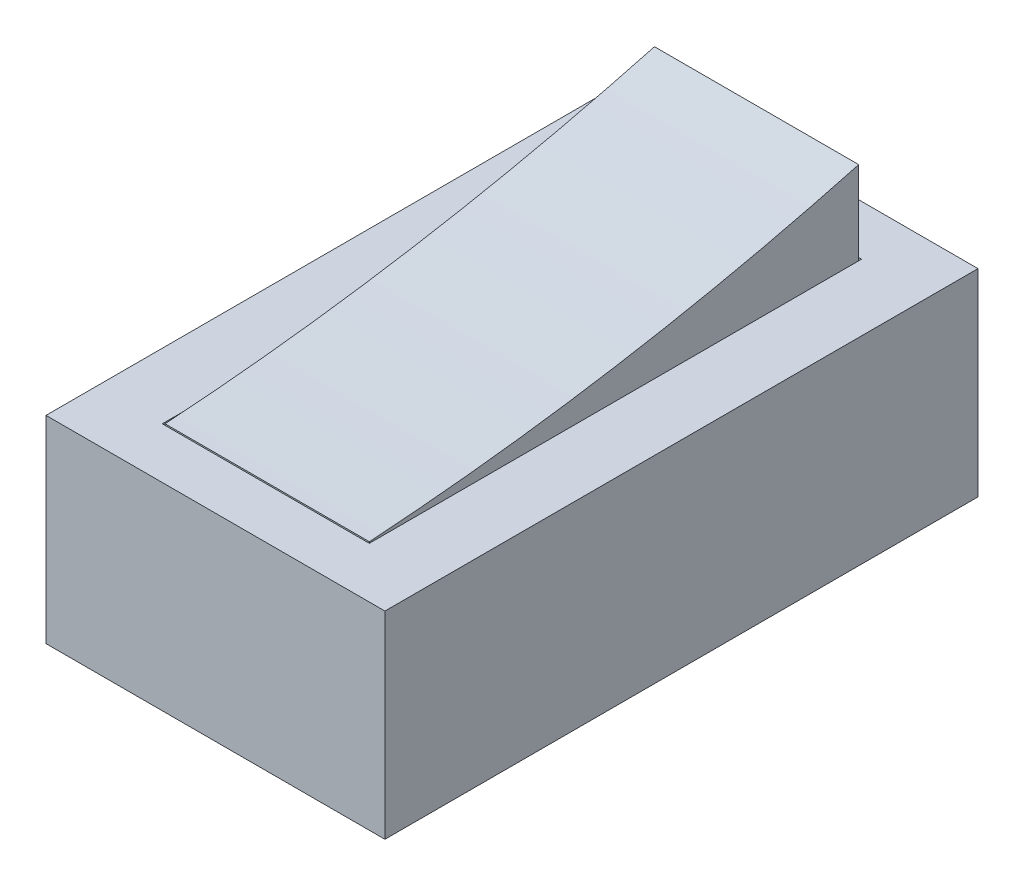
ISO-10303-21;
HEADER;
FILE_DESCRIPTION(('STEP AP214'),'2;1');
FILE_NAME('part.step','',(''),(''),'','','');
FILE_SCHEMA(('AUTOMOTIVE_DESIGN { 1 0 10303 214 1 1 1 1 }'));
ENDSEC;
DATA;
#1=APPLICATION_CONTEXT('core data for automotive mechanical design processes');
#2=APPLICATION_PROTOCOL_DEFINITION('international standard','automotive_design',2000,#1);
#3=PRODUCT_CONTEXT('',#1,'mechanical');
#4=PRODUCT('Part','Part','',(#3));
#5=PRODUCT_RELATED_PRODUCT_CATEGORY('part','',(#4));
#6=PRODUCT_DEFINITION_FORMATION('','',#4);
#7=PRODUCT_DEFINITION_CONTEXT('part definition',#1,'design');
#8=PRODUCT_DEFINITION('design','',#6,#7);
#9=PRODUCT_DEFINITION_SHAPE('','',#8);
#10=(LENGTH_UNIT() NAMED_UNIT(*) SI_UNIT(.MILLI.,.METRE.));
#11=(NAMED_UNIT(*) PLANE_ANGLE_UNIT() SI_UNIT($,.RADIAN.));
#12=(NAMED_UNIT(*) SI_UNIT($,.STERADIAN.) SOLID_ANGLE_UNIT());
#13=UNCERTAINTY_MEASURE_WITH_UNIT(LENGTH_MEASURE(1.E-05),#10,'distance_accuracy_value','');
#14=(GEOMETRIC_REPRESENTATION_CONTEXT(3) GLOBAL_UNCERTAINTY_ASSIGNED_CONTEXT((#13)) GLOBAL_UNIT_ASSIGNED_CONTEXT((#10,
#11,#12)) REPRESENTATION_CONTEXT('',''));
#15=CARTESIAN_POINT('',(0.,0.,0.));
#16=DIRECTION('',(0.,0.,1.));
#17=DIRECTION('',(1.,0.,0.));
#18=AXIS2_PLACEMENT_3D('',#15,#16,#17);
#19=CARTESIAN_POINT('',(6.,7.,-10.5));
#20=DIRECTION('',(-1.,0.,0.));
#21=DIRECTION('',(0.,0.,1.));
#22=AXIS2_PLACEMENT_3D('',#19,#20,#21);
#23=PLANE('',#22);
#24=DIRECTION('',(0.,0.,-1.));
#25=VECTOR('',#24,1.);
#26=CARTESIAN_POINT('',(6.,0.,-10.5));
#27=LINE('',#26,#25);
#28=CARTESIAN_POINT('',(6.,0.,10.5));
#29=VERTEX_POINT('',#28);
#30=CARTESIAN_POINT('',(6.,0.,-10.5));
#31=VERTEX_POINT('',#30);
#32=EDGE_CURVE('E134',#29,#31,#27,.T.);
#33=ORIENTED_EDGE('',*,*,#32,.T.);
#34=DIRECTION('',(0.,-1.,0.));
#35=VECTOR('',#34,1.);
#36=CARTESIAN_POINT('',(6.,7.,-10.5));
#37=LINE('',#36,#35);
#38=CARTESIAN_POINT('',(6.,7.,-10.5));
#39=VERTEX_POINT('',#38);
#40=EDGE_CURVE('E141',#39,#31,#37,.T.);
#41=ORIENTED_EDGE('',*,*,#40,.F.);
#42=DIRECTION('',(0.,0.,-1.));
#43=VECTOR('',#42,1.);
#44=CARTESIAN_POINT('',(6.,7.,-10.5));
#45=LINE('',#44,#43);
#46=CARTESIAN_POINT('',(6.,7.,10.5));
#47=VERTEX_POINT('',#46);
#48=EDGE_CURVE('E122',#47,#39,#45,.T.);
#49=ORIENTED_EDGE('',*,*,#48,.F.);
#50=DIRECTION('',(0.,-1.,0.));
#51=VECTOR('',#50,1.);
#52=CARTESIAN_POINT('',(6.,7.,10.5));
#53=LINE('',#52,#51);
#54=EDGE_CURVE('E137',#47,#29,#53,.T.);
#55=ORIENTED_EDGE('',*,*,#54,.T.);
#56=EDGE_LOOP('',(#33,#41,#49,#55));
#57=FACE_BOUND('',#56,.T.);
#58=ADVANCED_FACE('F43',(#57),#23,.F.);
#59=CARTESIAN_POINT('',(-6.,7.,-10.5));
#60=DIRECTION('',(0.,0.,1.));
#61=DIRECTION('',(1.,0.,0.));
#62=AXIS2_PLACEMENT_3D('',#59,#60,#61);
#63=PLANE('',#62);
#64=DIRECTION('',(-1.,0.,0.));
#65=VECTOR('',#64,1.);
#66=CARTESIAN_POINT('',(-6.,0.,-10.5));
#67=LINE('',#66,#65);
#68=CARTESIAN_POINT('',(-6.,0.,-10.5));
#69=VERTEX_POINT('',#68);
#70=EDGE_CURVE('E138',#31,#69,#67,.T.);
#71=ORIENTED_EDGE('',*,*,#70,.T.);
#72=DIRECTION('',(0.,-1.,0.));
#73=VECTOR('',#72,1.);
#74=CARTESIAN_POINT('',(-6.,7.,-10.5));
#75=LINE('',#74,#73);
#76=CARTESIAN_POINT('',(-6.,7.,-10.5));
#77=VERTEX_POINT('',#76);
#78=EDGE_CURVE('E145',#77,#69,#75,.T.);
#79=ORIENTED_EDGE('',*,*,#78,.F.);
#80=DIRECTION('',(-1.,0.,0.));
#81=VECTOR('',#80,1.);
#82=CARTESIAN_POINT('',(-6.,7.,-10.5));
#83=LINE('',#82,#81);
#84=EDGE_CURVE('E125',#39,#77,#83,.T.);
#85=ORIENTED_EDGE('',*,*,#84,.F.);
#86=ORIENTED_EDGE('',*,*,#40,.T.);
#87=EDGE_LOOP('',(#71,#79,#85,#86));
#88=FACE_BOUND('',#87,.T.);
#89=ADVANCED_FACE('F160',(#88),#63,.F.);
#90=CARTESIAN_POINT('',(-6.,7.,-10.5));
#91=DIRECTION('',(1.,0.,0.));
#92=DIRECTION('',(0.,0.,-1.));
#93=AXIS2_PLACEMENT_3D('',#90,#91,#92);
#94=PLANE('',#93);
#95=DIRECTION('',(0.,0.,1.));
#96=VECTOR('',#95,1.);
#97=CARTESIAN_POINT('',(-6.,0.,-10.5));
#98=LINE('',#97,#96);
#99=CARTESIAN_POINT('',(-5.99999999999999,0.,10.5));
#100=VERTEX_POINT('',#99);
#101=EDGE_CURVE('E142',#69,#100,#98,.T.);
#102=ORIENTED_EDGE('',*,*,#101,.T.);
#103=DIRECTION('',(0.,-1.,0.));
#104=VECTOR('',#103,1.);
#105=CARTESIAN_POINT('',(-5.99999999999999,7.,10.5));
#106=LINE('',#105,#104);
#107=CARTESIAN_POINT('',(-5.99999999999999,7.,10.5));
#108=VERTEX_POINT('',#107);
#109=EDGE_CURVE('E126',#108,#100,#106,.T.);
#110=ORIENTED_EDGE('',*,*,#109,.F.);
#111=DIRECTION('',(0.,0.,1.));
#112=VECTOR('',#111,1.);
#113=CARTESIAN_POINT('',(-6.,7.,-10.5));
#114=LINE('',#113,#112);
#115=EDGE_CURVE('E129',#77,#108,#114,.T.);
#116=ORIENTED_EDGE('',*,*,#115,.F.);
#117=ORIENTED_EDGE('',*,*,#78,.T.);
#118=EDGE_LOOP('',(#102,#110,#116,#117));
#119=FACE_BOUND('',#118,.T.);
#120=ADVANCED_FACE('F190',(#119),#94,.F.);
#121=CARTESIAN_POINT('',(-5.99999999999999,7.,10.5));
#122=DIRECTION('',(0.,0.,-1.));
#123=DIRECTION('',(-1.,0.,0.));
#124=AXIS2_PLACEMENT_3D('',#121,#122,#123);
#125=PLANE('',#124);
#126=DIRECTION('',(1.,0.,0.));
#127=VECTOR('',#126,1.);
#128=CARTESIAN_POINT('',(-5.99999999999999,0.,10.5));
#129=LINE('',#128,#127);
#130=EDGE_CURVE('E146',#100,#29,#129,.T.);
#131=ORIENTED_EDGE('',*,*,#130,.T.);
#132=ORIENTED_EDGE('',*,*,#54,.F.);
#133=DIRECTION('',(1.,0.,0.));
#134=VECTOR('',#133,1.);
#135=CARTESIAN_POINT('',(-5.99999999999999,7.,10.5));
#136=LINE('',#135,#134);
#137=EDGE_CURVE('E105',#108,#47,#136,.T.);
#138=ORIENTED_EDGE('',*,*,#137,.F.);
#139=ORIENTED_EDGE('',*,*,#109,.T.);
#140=EDGE_LOOP('',(#131,#132,#138,#139));
#141=FACE_BOUND('',#140,.T.);
#142=ADVANCED_FACE('F191',(#141),#125,.F.);
#143=CARTESIAN_POINT('',(0.,7.,0.));
#144=DIRECTION('',(0.,1.,0.));
#145=DIRECTION('',(0.,0.,1.));
#146=AXIS2_PLACEMENT_3D('',#143,#144,#145);
#147=PLANE('',#146);
#148=DIRECTION('',(1.,0.,0.));
#149=VECTOR('',#148,1.);
#150=CARTESIAN_POINT('',(3.64870441676673,7.,8.69967409691391));
#151=LINE('',#150,#149);
#152=CARTESIAN_POINT('',(-3.68389656722962,7.,8.69967409691391));
#153=VERTEX_POINT('',#152);
#154=CARTESIAN_POINT('',(3.64870441676673,7.,8.69967409691391));
#155=VERTEX_POINT('',#154);
#156=EDGE_CURVE('E87',#153,#155,#151,.T.);
#157=ORIENTED_EDGE('',*,*,#156,.F.);
#158=DIRECTION('',(0.,0.,1.));
#159=VECTOR('',#158,1.);
#160=CARTESIAN_POINT('',(-3.68389656722962,7.,-8.72779123921351));
#161=LINE('',#160,#159);
#162=CARTESIAN_POINT('',(-3.68389656722962,7.,-8.72779123921351));
#163=VERTEX_POINT('',#162);
#164=EDGE_CURVE('E78',#163,#153,#161,.T.);
#165=ORIENTED_EDGE('',*,*,#164,.F.);
#166=DIRECTION('',(-1.,0.,0.));
#167=VECTOR('',#166,1.);
#168=CARTESIAN_POINT('',(3.64870441676673,7.,-8.72779123921351));
#169=LINE('',#168,#167);
#170=CARTESIAN_POINT('',(3.64870441676673,7.,-8.72779123921351));
#171=VERTEX_POINT('',#170);
#172=EDGE_CURVE('E53',#171,#163,#169,.T.);
#173=ORIENTED_EDGE('',*,*,#172,.F.);
#174=DIRECTION('',(0.,0.,-1.));
#175=VECTOR('',#174,1.);
#176=CARTESIAN_POINT('',(3.64870441676673,7.,-8.72779123921351));
#177=LINE('',#176,#175);
#178=EDGE_CURVE('E95',#155,#171,#177,.T.);
#179=ORIENTED_EDGE('',*,*,#178,.F.);
#180=EDGE_LOOP('',(#157,#165,#173,#179));
#181=FACE_BOUND('',#180,.T.);
#182=ORIENTED_EDGE('',*,*,#48,.T.);
#183=ORIENTED_EDGE('',*,*,#84,.T.);
#184=ORIENTED_EDGE('',*,*,#115,.T.);
#185=ORIENTED_EDGE('',*,*,#137,.T.);
#186=EDGE_LOOP('',(#182,#183,#184,#185));
#187=FACE_BOUND('',#186,.T.);
#188=ADVANCED_FACE('F45',(#181,#187),#147,.T.);
#189=CARTESIAN_POINT('',(0.,0.,0.));
#190=DIRECTION('',(0.,1.,0.));
#191=DIRECTION('',(0.,0.,1.));
#192=AXIS2_PLACEMENT_3D('',#189,#190,#191);
#193=PLANE('',#192);
#194=DIRECTION('',(1.,0.,0.));
#195=VECTOR('',#194,1.);
#196=CARTESIAN_POINT('',(3.64870441676673,0.,8.69967409691391));
#197=LINE('',#196,#195);
#198=CARTESIAN_POINT('',(-3.68389656722962,0.,8.69967409691391));
#199=VERTEX_POINT('',#198);
#200=CARTESIAN_POINT('',(3.64870441676673,0.,8.69967409691391));
#201=VERTEX_POINT('',#200);
#202=EDGE_CURVE('E90',#199,#201,#197,.T.);
#203=ORIENTED_EDGE('',*,*,#202,.T.);
#204=DIRECTION('',(0.,0.,-1.));
#205=VECTOR('',#204,1.);
#206=CARTESIAN_POINT('',(3.64870441676673,0.,-8.72779123921351));
#207=LINE('',#206,#205);
#208=CARTESIAN_POINT('',(3.64870441676673,0.,-8.72779123921351));
#209=VERTEX_POINT('',#208);
#210=EDGE_CURVE('E47',#201,#209,#207,.T.);
#211=ORIENTED_EDGE('',*,*,#210,.T.);
#212=DIRECTION('',(-1.,0.,0.));
#213=VECTOR('',#212,1.);
#214=CARTESIAN_POINT('',(3.64870441676673,0.,-8.72779123921351));
#215=LINE('',#214,#213);
#216=CARTESIAN_POINT('',(-3.68389656722962,0.,-8.72779123921351));
#217=VERTEX_POINT('',#216);
#218=EDGE_CURVE('E106',#209,#217,#215,.T.);
#219=ORIENTED_EDGE('',*,*,#218,.T.);
#220=DIRECTION('',(0.,0.,1.));
#221=VECTOR('',#220,1.);
#222=CARTESIAN_POINT('',(-3.68389656722962,0.,-8.72779123921351));
#223=LINE('',#222,#221);
#224=EDGE_CURVE('E103',#217,#199,#223,.T.);
#225=ORIENTED_EDGE('',*,*,#224,.T.);
#226=EDGE_LOOP('',(#203,#211,#219,#225));
#227=FACE_BOUND('',#226,.T.);
#228=ORIENTED_EDGE('',*,*,#32,.F.);
#229=ORIENTED_EDGE('',*,*,#130,.F.);
#230=ORIENTED_EDGE('',*,*,#101,.F.);
#231=ORIENTED_EDGE('',*,*,#70,.F.);
#232=EDGE_LOOP('',(#228,#229,#230,#231));
#233=FACE_BOUND('',#232,.T.);
#234=ADVANCED_FACE('F112',(#227,#233),#193,.F.);
#235=CARTESIAN_POINT('',(3.64870441676673,0.,-8.72779123921351));
#236=DIRECTION('',(1.,0.,0.));
#237=DIRECTION('',(0.,0.,-1.));
#238=AXIS2_PLACEMENT_3D('',#235,#236,#237);
#239=PLANE('',#238);
#240=ORIENTED_EDGE('',*,*,#178,.T.);
#241=DIRECTION('',(0.,1.,0.));
#242=VECTOR('',#241,1.);
#243=CARTESIAN_POINT('',(3.64870441676673,0.,-8.72779123921351));
#244=LINE('',#243,#242);
#245=EDGE_CURVE('E12',#209,#171,#244,.T.);
#246=ORIENTED_EDGE('',*,*,#245,.F.);
#247=ORIENTED_EDGE('',*,*,#210,.F.);
#248=DIRECTION('',(0.,1.,0.));
#249=VECTOR('',#248,1.);
#250=CARTESIAN_POINT('',(3.64870441676673,0.,8.69967409691391));
#251=LINE('',#250,#249);
#252=EDGE_CURVE('E96',#201,#155,#251,.T.);
#253=ORIENTED_EDGE('',*,*,#252,.T.);
#254=EDGE_LOOP('',(#240,#246,#247,#253));
#255=FACE_BOUND('',#254,.T.);
#256=ADVANCED_FACE('F117',(#255),#239,.F.);
#257=CARTESIAN_POINT('',(3.64870441676673,0.,8.69967409691391));
#258=DIRECTION('',(0.,0.,1.));
#259=DIRECTION('',(1.,0.,0.));
#260=AXIS2_PLACEMENT_3D('',#257,#258,#259);
#261=PLANE('',#260);
#262=ORIENTED_EDGE('',*,*,#156,.T.);
#263=ORIENTED_EDGE('',*,*,#252,.F.);
#264=ORIENTED_EDGE('',*,*,#202,.F.);
#265=DIRECTION('',(0.,1.,0.));
#266=VECTOR('',#265,1.);
#267=CARTESIAN_POINT('',(-3.68389656722962,0.,8.69967409691391));
#268=LINE('',#267,#266);
#269=EDGE_CURVE('E75',#199,#153,#268,.T.);
#270=ORIENTED_EDGE('',*,*,#269,.T.);
#271=EDGE_LOOP('',(#262,#263,#264,#270));
#272=FACE_BOUND('',#271,.T.);
#273=ADVANCED_FACE('F86',(#272),#261,.F.);
#274=CARTESIAN_POINT('',(-3.68389656722962,0.,-8.72779123921351));
#275=DIRECTION('',(-1.,0.,0.));
#276=DIRECTION('',(0.,0.,1.));
#277=AXIS2_PLACEMENT_3D('',#274,#275,#276);
#278=PLANE('',#277);
#279=ORIENTED_EDGE('',*,*,#164,.T.);
#280=ORIENTED_EDGE('',*,*,#269,.F.);
#281=ORIENTED_EDGE('',*,*,#224,.F.);
#282=DIRECTION('',(0.,1.,0.));
#283=VECTOR('',#282,1.);
#284=CARTESIAN_POINT('',(-3.68389656722962,0.,-8.72779123921351));
#285=LINE('',#284,#283);
#286=EDGE_CURVE('E62',#217,#163,#285,.T.);
#287=ORIENTED_EDGE('',*,*,#286,.T.);
#288=EDGE_LOOP('',(#279,#280,#281,#287));
#289=FACE_BOUND('',#288,.T.);
#290=ADVANCED_FACE('F79',(#289),#278,.F.);
#291=CARTESIAN_POINT('',(3.64870441676673,0.,-8.72779123921351));
#292=DIRECTION('',(0.,0.,-1.));
#293=DIRECTION('',(-1.,0.,0.));
#294=AXIS2_PLACEMENT_3D('',#291,#292,#293);
#295=PLANE('',#294);
#296=ORIENTED_EDGE('',*,*,#172,.T.);
#297=ORIENTED_EDGE('',*,*,#286,.F.);
#298=ORIENTED_EDGE('',*,*,#218,.F.);
#299=ORIENTED_EDGE('',*,*,#245,.T.);
#300=EDGE_LOOP('',(#296,#297,#298,#299));
#301=FACE_BOUND('',#300,.T.);
#302=ADVANCED_FACE('F119',(#301),#295,.F.);
#303=CLOSED_SHELL('',(#58,#89,#120,#142,#188,#234,#256,#273,#290,#302));
#304=MANIFOLD_SOLID_BREP('B2',#303);
#305=CARTESIAN_POINT('',(3.59870441676673,0.,-8.67779123921351));
#306=DIRECTION('',(0.,0.,-1.));
#307=DIRECTION('',(-1.,0.,0.));
#308=AXIS2_PLACEMENT_3D('',#305,#306,#307);
#309=PLANE('',#308);
#310=DIRECTION('',(0.,1.,0.));
#311=VECTOR('',#310,1.);
#312=CARTESIAN_POINT('',(-3.63389656722962,0.,-8.67779123921351));
#313=LINE('',#312,#311);
#314=CARTESIAN_POINT('',(-3.63389656722962,0.,-8.67779123921351));
#315=VERTEX_POINT('',#314);
#316=CARTESIAN_POINT('',(-3.63389656722962,9.89956230992471,-8.67779123921351));
#317=VERTEX_POINT('',#316);
#318=EDGE_CURVE('E318',#315,#317,#313,.T.);
#319=ORIENTED_EDGE('',*,*,#318,.T.);
#320=DIRECTION('',(1.,0.,0.));
#321=VECTOR('',#320,1.);
#322=CARTESIAN_POINT('',(-6.,9.89956230992471,-8.67779123921351));
#323=LINE('',#322,#321);
#324=CARTESIAN_POINT('',(3.59870441676673,9.89956230992471,-8.67779123921351));
#325=VERTEX_POINT('',#324);
#326=EDGE_CURVE('E311',#317,#325,#323,.T.);
#327=ORIENTED_EDGE('',*,*,#326,.T.);
#328=DIRECTION('',(0.,1.,0.));
#329=VECTOR('',#328,1.);
#330=CARTESIAN_POINT('',(3.59870441676673,0.,-8.67779123921351));
#331=LINE('',#330,#329);
#332=CARTESIAN_POINT('',(3.59870441676673,0.,-8.67779123921351));
#333=VERTEX_POINT('',#332);
#334=EDGE_CURVE('E271',#333,#325,#331,.T.);
#335=ORIENTED_EDGE('',*,*,#334,.F.);
#336=DIRECTION('',(-1.,0.,0.));
#337=VECTOR('',#336,1.);
#338=CARTESIAN_POINT('',(3.59870441676673,0.,-8.67779123921351));
#339=LINE('',#338,#337);
#340=EDGE_CURVE('E328',#333,#315,#339,.T.);
#341=ORIENTED_EDGE('',*,*,#340,.T.);
#342=EDGE_LOOP('',(#319,#327,#335,#341));
#343=FACE_BOUND('',#342,.T.);
#344=ADVANCED_FACE('F267',(#343),#309,.T.);
#345=CARTESIAN_POINT('',(-3.63389656722962,0.,-8.67779123921351));
#346=DIRECTION('',(-1.,0.,0.));
#347=DIRECTION('',(0.,0.,1.));
#348=AXIS2_PLACEMENT_3D('',#345,#346,#347);
#349=PLANE('',#348);
#350=DIRECTION('',(0.,1.,0.));
#351=VECTOR('',#350,1.);
#352=CARTESIAN_POINT('',(-3.63389656722962,0.,8.64967409691391));
#353=LINE('',#352,#351);
#354=CARTESIAN_POINT('',(-3.63389656722962,0.,8.64967409691391));
#355=VERTEX_POINT('',#354);
#356=CARTESIAN_POINT('',(-3.63389656722962,7.00000176059505,8.64967409691391));
#357=VERTEX_POINT('',#356);
#358=EDGE_CURVE('E276',#355,#357,#353,.T.);
#359=ORIENTED_EDGE('',*,*,#358,.T.);
#360=CARTESIAN_POINT('',(-3.63389656722962,95.4753985301179,14.5487202008537));
#361=DIRECTION('',(-1.,0.,0.));
#362=DIRECTION('',(0.,0.,1.));
#363=AXIS2_PLACEMENT_3D('',#360,#361,#362);
#364=CIRCLE('',#363,88.671836444617);
#365=EDGE_CURVE('E335',#357,#317,#364,.F.);
#366=ORIENTED_EDGE('',*,*,#365,.T.);
#367=ORIENTED_EDGE('',*,*,#318,.F.);
#368=DIRECTION('',(0.,0.,1.));
#369=VECTOR('',#368,1.);
#370=CARTESIAN_POINT('',(-3.63389656722962,0.,-8.67779123921351));
#371=LINE('',#370,#369);
#372=EDGE_CURVE('E323',#315,#355,#371,.T.);
#373=ORIENTED_EDGE('',*,*,#372,.T.);
#374=EDGE_LOOP('',(#359,#366,#367,#373));
#375=FACE_BOUND('',#374,.T.);
#376=ADVANCED_FACE('F334',(#375),#349,.T.);
#377=CARTESIAN_POINT('',(3.59870441676673,0.,8.64967409691391));
#378=DIRECTION('',(0.,0.,1.));
#379=DIRECTION('',(1.,0.,0.));
#380=AXIS2_PLACEMENT_3D('',#377,#378,#379);
#381=PLANE('',#380);
#382=DIRECTION('',(0.,1.,0.));
#383=VECTOR('',#382,1.);
#384=CARTESIAN_POINT('',(3.59870441676673,0.,8.64967409691391));
#385=LINE('',#384,#383);
#386=CARTESIAN_POINT('',(3.59870441676673,0.,8.64967409691391));
#387=VERTEX_POINT('',#386);
#388=CARTESIAN_POINT('',(3.59870441676673,7.00000176059505,8.64967409691391));
#389=VERTEX_POINT('',#388);
#390=EDGE_CURVE('E41',#387,#389,#385,.T.);
#391=ORIENTED_EDGE('',*,*,#390,.T.);
#392=DIRECTION('',(1.,0.,0.));
#393=VECTOR('',#392,1.);
#394=CARTESIAN_POINT('',(-6.,7.00000176059505,8.64967409691391));
#395=LINE('',#394,#393);
#396=EDGE_CURVE('E284',#357,#389,#395,.T.);
#397=ORIENTED_EDGE('',*,*,#396,.F.);
#398=ORIENTED_EDGE('',*,*,#358,.F.);
#399=DIRECTION('',(1.,0.,0.));
#400=VECTOR('',#399,1.);
#401=CARTESIAN_POINT('',(3.59870441676673,0.,8.64967409691391));
#402=LINE('',#401,#400);
#403=EDGE_CURVE('E321',#355,#387,#402,.T.);
#404=ORIENTED_EDGE('',*,*,#403,.T.);
#405=EDGE_LOOP('',(#391,#397,#398,#404));
#406=FACE_BOUND('',#405,.T.);
#407=ADVANCED_FACE('F337',(#406),#381,.T.);
#408=CARTESIAN_POINT('',(3.59870441676673,0.,-8.67779123921351));
#409=DIRECTION('',(1.,0.,0.));
#410=DIRECTION('',(0.,0.,-1.));
#411=AXIS2_PLACEMENT_3D('',#408,#409,#410);
#412=PLANE('',#411);
#413=ORIENTED_EDGE('',*,*,#334,.T.);
#414=CARTESIAN_POINT('',(3.59870441676673,95.4753985301179,14.5487202008537));
#415=DIRECTION('',(1.,0.,0.));
#416=DIRECTION('',(0.,0.,-1.));
#417=AXIS2_PLACEMENT_3D('',#414,#415,#416);
#418=CIRCLE('',#417,88.671836444617);
#419=EDGE_CURVE('E308',#325,#389,#418,.F.);
#420=ORIENTED_EDGE('',*,*,#419,.T.);
#421=ORIENTED_EDGE('',*,*,#390,.F.);
#422=DIRECTION('',(0.,0.,-1.));
#423=VECTOR('',#422,1.);
#424=CARTESIAN_POINT('',(3.59870441676673,0.,-8.67779123921351));
#425=LINE('',#424,#423);
#426=EDGE_CURVE('E292',#387,#333,#425,.T.);
#427=ORIENTED_EDGE('',*,*,#426,.T.);
#428=EDGE_LOOP('',(#413,#420,#421,#427));
#429=FACE_BOUND('',#428,.T.);
#430=ADVANCED_FACE('F320',(#429),#412,.T.);
#431=CARTESIAN_POINT('',(0.,0.,0.));
#432=DIRECTION('',(0.,1.,0.));
#433=DIRECTION('',(0.,0.,1.));
#434=AXIS2_PLACEMENT_3D('',#431,#432,#433);
#435=PLANE('',#434);
#436=ORIENTED_EDGE('',*,*,#426,.F.);
#437=ORIENTED_EDGE('',*,*,#403,.F.);
#438=ORIENTED_EDGE('',*,*,#372,.F.);
#439=ORIENTED_EDGE('',*,*,#340,.F.);
#440=EDGE_LOOP('',(#436,#437,#438,#439));
#441=FACE_BOUND('',#440,.T.);
#442=ADVANCED_FACE('F269',(#441),#435,.F.);
#443=CARTESIAN_POINT('',(-6.,95.4753985301179,14.5487202008537));
#444=DIRECTION('',(1.,0.,0.));
#445=DIRECTION('',(0.,0.,-1.));
#446=AXIS2_PLACEMENT_3D('',#443,#444,#445);
#447=CYLINDRICAL_SURFACE('',#446,88.671836444617);
#448=ORIENTED_EDGE('',*,*,#396,.T.);
#449=ORIENTED_EDGE('',*,*,#419,.F.);
#450=ORIENTED_EDGE('',*,*,#326,.F.);
#451=ORIENTED_EDGE('',*,*,#365,.F.);
#452=EDGE_LOOP('',(#448,#449,#450,#451));
#453=FACE_BOUND('',#452,.T.);
#454=ADVANCED_FACE('F310',(#453),#447,.F.);
#455=CLOSED_SHELL('',(#344,#376,#407,#430,#442,#454));
#456=MANIFOLD_SOLID_BREP('B6',#455);
#457=ADVANCED_BREP_SHAPE_REPRESENTATION('',(#18,#304,#456),#14);
#458=SHAPE_DEFINITION_REPRESENTATION(#9,#457);
ENDSEC;
END-ISO-10303-21;
